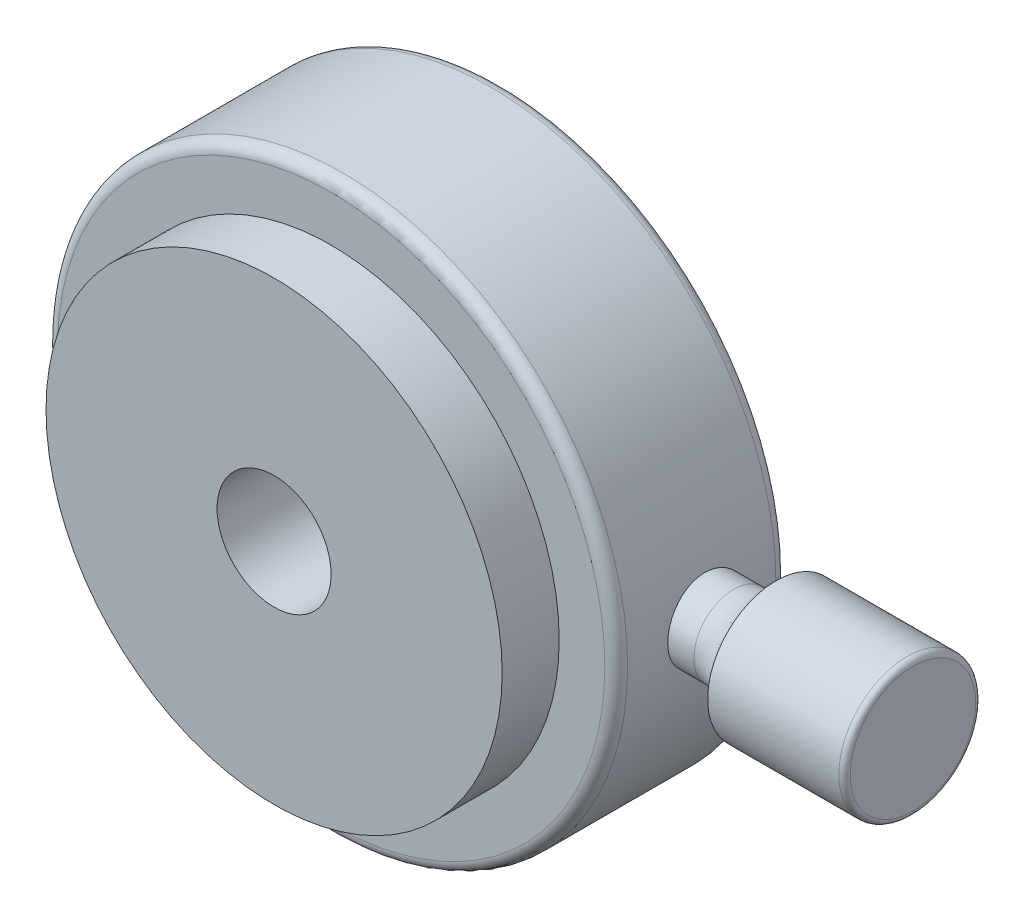
ISO-10303-21;
HEADER;
FILE_DESCRIPTION(('STEP AP214'),'2;1');
FILE_NAME('part.step','',(''),(''),'','','');
FILE_SCHEMA(('AUTOMOTIVE_DESIGN { 1 0 10303 214 1 1 1 1 }'));
ENDSEC;
DATA;
#1=APPLICATION_CONTEXT('core data for automotive mechanical design processes');
#2=APPLICATION_PROTOCOL_DEFINITION('international standard','automotive_design',2000,#1);
#3=PRODUCT_CONTEXT('',#1,'mechanical');
#4=PRODUCT('Part','Part','',(#3));
#5=PRODUCT_RELATED_PRODUCT_CATEGORY('part','',(#4));
#6=PRODUCT_DEFINITION_FORMATION('','',#4);
#7=PRODUCT_DEFINITION_CONTEXT('part definition',#1,'design');
#8=PRODUCT_DEFINITION('design','',#6,#7);
#9=PRODUCT_DEFINITION_SHAPE('','',#8);
#10=(LENGTH_UNIT() NAMED_UNIT(*) SI_UNIT(.MILLI.,.METRE.));
#11=(NAMED_UNIT(*) PLANE_ANGLE_UNIT() SI_UNIT($,.RADIAN.));
#12=(NAMED_UNIT(*) SI_UNIT($,.STERADIAN.) SOLID_ANGLE_UNIT());
#13=UNCERTAINTY_MEASURE_WITH_UNIT(LENGTH_MEASURE(1.E-05),#10,'distance_accuracy_value','');
#14=(GEOMETRIC_REPRESENTATION_CONTEXT(3) GLOBAL_UNCERTAINTY_ASSIGNED_CONTEXT((#13)) GLOBAL_UNIT_ASSIGNED_CONTEXT((#10,
#11,#12)) REPRESENTATION_CONTEXT('',''));
#15=CARTESIAN_POINT('',(0.,0.,0.));
#16=DIRECTION('',(0.,0.,1.));
#17=DIRECTION('',(1.,0.,0.));
#18=AXIS2_PLACEMENT_3D('',#15,#16,#17);
#19=CARTESIAN_POINT('',(0.,0.,20.));
#20=DIRECTION('',(0.,0.,-1.));
#21=DIRECTION('',(-1.,0.,0.));
#22=AXIS2_PLACEMENT_3D('',#19,#20,#21);
#23=CYLINDRICAL_SURFACE('',#22,25.);
#24=CARTESIAN_POINT('',(0.,0.,14.));
#25=DIRECTION('',(0.,0.,1.));
#26=DIRECTION('',(1.,0.,0.));
#27=AXIS2_PLACEMENT_3D('',#24,#25,#26);
#28=CIRCLE('',#27,25.);
#29=CARTESIAN_POINT('',(25.,0.,14.));
#30=VERTEX_POINT('',#29);
#31=EDGE_CURVE('E10',#30,#30,#28,.F.);
#32=ORIENTED_EDGE('',*,*,#31,.T.);
#33=EDGE_LOOP('',(#32));
#34=FACE_BOUND('',#33,.T.);
#35=CARTESIAN_POINT('',(0.,0.,1.));
#36=DIRECTION('',(0.,0.,1.));
#37=DIRECTION('',(1.,0.,0.));
#38=AXIS2_PLACEMENT_3D('',#35,#36,#37);
#39=CIRCLE('',#38,25.);
#40=CARTESIAN_POINT('',(25.,0.,1.));
#41=VERTEX_POINT('',#40);
#42=EDGE_CURVE('E46',#41,#41,#39,.T.);
#43=ORIENTED_EDGE('',*,*,#42,.T.);
#44=EDGE_LOOP('',(#43));
#45=FACE_BOUND('',#44,.T.);
#46=CARTESIAN_POINT('',(25.,0.,10.4832262334966));
#47=CARTESIAN_POINT('',(24.9999970176063,-0.195570742970434,10.4832180592283));
#48=CARTESIAN_POINT('',(24.9976809957743,-0.391258654311664,10.4667789583617));
#49=CARTESIAN_POINT('',(24.9886647697315,-0.777175004077514,10.4014676884545));
#50=CARTESIAN_POINT('',(24.9819601664713,-0.967397764382741,10.3525629756643));
#51=CARTESIAN_POINT('',(24.9649210103539,-1.33674214307026,10.2238016938027));
#52=CARTESIAN_POINT('',(24.954589075763,-1.51587165931347,10.1439674458788));
#53=CARTESIAN_POINT('',(24.9314400607072,-1.85816108849893,9.9556655186123));
#54=CARTESIAN_POINT('',(24.918623359462,-2.02132343260508,9.84720220766218));
#55=CARTESIAN_POINT('',(24.8918344121167,-2.32819354537413,9.60392923385688));
#56=CARTESIAN_POINT('',(24.8778555790759,-2.47177624724488,9.46896251780644));
#57=CARTESIAN_POINT('',(24.8503700719734,-2.73433301369379,9.17685169663006));
#58=CARTESIAN_POINT('',(24.8368634237504,-2.85330573331174,9.01970638021051));
#59=CARTESIAN_POINT('',(24.8117873738253,-3.06374374623177,8.68686989849577));
#60=CARTESIAN_POINT('',(24.8002264781108,-3.15508958481628,8.51110251091403));
#61=CARTESIAN_POINT('',(24.7804397305765,-3.30691771566836,8.1465321589285));
#62=CARTESIAN_POINT('',(24.7722137205098,-3.36740147243805,7.95772981355695));
#63=CARTESIAN_POINT('',(24.7600922282601,-3.45540346500133,7.57375762375901));
#64=CARTESIAN_POINT('',(24.7561687799919,-3.48313467991529,7.37863749035471));
#65=CARTESIAN_POINT('',(24.7530114923225,-3.50550387523255,6.98647667014665));
#66=CARTESIAN_POINT('',(24.7537774178066,-3.50014351477353,6.78943608012484));
#67=CARTESIAN_POINT('',(24.7598867512402,-3.45665609443046,6.4005235409128));
#68=CARTESIAN_POINT('',(24.7651971750381,-3.41876513654997,6.20862459891659));
#69=CARTESIAN_POINT('',(24.7797456703488,-3.31166118779443,5.83393559127942));
#70=CARTESIAN_POINT('',(24.7889838397833,-3.24244741601386,5.65114575286262));
#71=CARTESIAN_POINT('',(24.8103837697583,-3.07441355823629,5.29913896456924));
#72=CARTESIAN_POINT('',(24.8225554849105,-2.97549237651918,5.12997090364507));
#73=CARTESIAN_POINT('',(24.848443673221,-2.75092383753964,4.81054597719025));
#74=CARTESIAN_POINT('',(24.8621602348336,-2.62527494954486,4.66029019557658));
#75=CARTESIAN_POINT('',(24.8897387365563,-2.34951644252588,4.38158579830341));
#76=CARTESIAN_POINT('',(24.9036009036065,-2.1992036099948,4.25333818521881));
#77=CARTESIAN_POINT('',(24.9297975950593,-1.87907961805429,4.02386073567364));
#78=CARTESIAN_POINT('',(24.9421321142372,-1.70926839196206,3.92263099161575));
#79=CARTESIAN_POINT('',(24.9638943133628,-1.35480180611974,3.75005679697451));
#80=CARTESIAN_POINT('',(24.9733206042101,-1.17013940570454,3.67872662195274));
#81=CARTESIAN_POINT('',(24.9881922918814,-0.791296074470108,3.56814469308335));
#82=CARTESIAN_POINT('',(24.9936379228574,-0.5971157042376,3.52889105240161));
#83=CARTESIAN_POINT('',(24.9999039529595,-0.206484619473599,3.48384088453226));
#84=CARTESIAN_POINT('',(25.0007625844934,-0.0100663906078466,3.47776778948761));
#85=CARTESIAN_POINT('',(24.9978615877468,0.380985361793391,3.49851879128312));
#86=CARTESIAN_POINT('',(24.9941020835279,0.575618933130424,3.52534200439651));
#87=CARTESIAN_POINT('',(24.9824109253701,0.956747830526828,3.61089430664105));
#88=CARTESIAN_POINT('',(24.9744967374262,1.14327371287825,3.66948986076997));
#89=CARTESIAN_POINT('',(24.9553812974364,1.50385292441477,3.81678355264141));
#90=CARTESIAN_POINT('',(24.9441799085868,1.6779057341326,3.90548294323994));
#91=CARTESIAN_POINT('',(24.9196412824301,2.00982227029193,4.11112383527056));
#92=CARTESIAN_POINT('',(24.9062908503287,2.16757540367405,4.22824223776781));
#93=CARTESIAN_POINT('',(24.8789845615088,2.46128538373665,4.48714864025714));
#94=CARTESIAN_POINT('',(24.8650286743798,2.59724113397425,4.62893788048384));
#95=CARTESIAN_POINT('',(24.837964517793,2.84449288719778,4.93438697314363));
#96=CARTESIAN_POINT('',(24.8248630725174,2.95560434633902,5.09819690319202));
#97=CARTESIAN_POINT('',(24.8011084829779,3.14873404639813,5.44231732922904));
#98=CARTESIAN_POINT('',(24.7904552794842,3.23075299116995,5.6226274258857));
#99=CARTESIAN_POINT('',(24.7728516368328,3.36307801706001,5.99406057592532));
#100=CARTESIAN_POINT('',(24.7658895295772,3.41348412457339,6.18514741732661));
#101=CARTESIAN_POINT('',(24.756424338007,3.48147267623345,6.57317810451184));
#102=CARTESIAN_POINT('',(24.7539209886034,3.49905707175051,6.77012160138896));
#103=CARTESIAN_POINT('',(24.7536657626721,3.5008610800916,7.16243727026385));
#104=CARTESIAN_POINT('',(24.7558725811514,3.48537073560524,7.35780814417351));
#105=CARTESIAN_POINT('',(24.7646996795934,3.42208342908976,7.74313846676543));
#106=CARTESIAN_POINT('',(24.7713199559317,3.37428649359221,7.93309791989164));
#107=CARTESIAN_POINT('',(24.7882142913337,3.24784044801316,8.30215043433931));
#108=CARTESIAN_POINT('',(24.7984862604381,3.16920898269277,8.48124964277249));
#109=CARTESIAN_POINT('',(24.8215294834637,2.98335451775796,8.8237597539607));
#110=CARTESIAN_POINT('',(24.8343007998048,2.87613080404222,8.98717026474641));
#111=CARTESIAN_POINT('',(24.8610374521525,2.6350720011466,9.29514205990198));
#112=CARTESIAN_POINT('',(24.875011897247,2.50102143681407,9.43953391100334));
#113=CARTESIAN_POINT('',(24.9025023174653,2.2105683780489,9.70387919101292));
#114=CARTESIAN_POINT('',(24.9160181846886,2.05416066763029,9.82382690114835));
#115=CARTESIAN_POINT('',(24.941141364036,1.7225630637984,10.0363814858853));
#116=CARTESIAN_POINT('',(24.9527392669044,1.54728715573015,10.1288552445862));
#117=CARTESIAN_POINT('',(24.9726265472969,1.18361903347201,10.2829173475781));
#118=CARTESIAN_POINT('',(24.9809194209081,0.995240928056702,10.344538345959));
#119=CARTESIAN_POINT('',(24.9913242600027,0.671634302408155,10.4208392900746));
#120=CARTESIAN_POINT('',(24.9945613190328,0.538422583784907,10.4441995502156));
#121=CARTESIAN_POINT('',(24.9989002083803,0.270159204102643,10.4753957667632));
#122=CARTESIAN_POINT('',(25.0000020603488,0.135107561714605,10.4832318805859));
#123=CARTESIAN_POINT('',(25.,0.,10.4832262334966));
#124=B_SPLINE_CURVE_WITH_KNOTS('',3,(#46,#47,#48,#49,#50,#51,#52,#53,#54,#55,#56,#57,#58,#59,
#60,#61,#62,#63,#64,#65,#66,#67,#68,#69,#70,#71,#72,#73,#74,#75,#76,#77,#78,#79,#80,#81,#82,#83,
#84,#85,#86,#87,#88,#89,#90,#91,#92,#93,#94,#95,#96,#97,#98,#99,#100,#101,#102,#103,#104,#105,
#106,#107,#108,#109,#110,#111,#112,#113,#114,#115,#116,#117,#118,#119,#120,#121,#122,#123),
.UNSPECIFIED.,.T.,.F.,(4,2,2,2,2,2,2,2,2,2,2,2,2,2,2,2,2,2,2,2,2,2,2,2,2,2,2,2,2,2,2,2,2,2,2,2,
2,2,4),(0.,0.586218614249914,1.17302574711756,1.75941018101674,2.34570519256895,
2.93558542263616,3.52549788173698,4.11792572603133,4.71032545516015,5.29885141296036,
5.88734786362289,6.47160886199991,7.05588442732396,7.64217128551205,8.22849173019637,
8.81991093883668,9.41133217013912,10.0030354550019,10.5947039316677,11.1814330981178,
11.7681465030146,12.3524129282013,12.9367036722645,13.5247292360132,14.1127843691054,
14.705072299911,15.2973459001353,15.8877359013683,16.4780908006462,17.0632899676966,
17.6484886541567,18.2333529538661,18.8182318621328,19.4080120921192,19.9979301447795,
20.5906615050764,21.1827641943972,21.5877499787411,21.9927316564709),.UNSPECIFIED.);
#125=CARTESIAN_POINT('',(25.,0.,10.4832262334966));
#126=VERTEX_POINT('',#125);
#127=EDGE_CURVE('E60',#126,#126,#124,.T.);
#128=ORIENTED_EDGE('',*,*,#127,.F.);
#129=EDGE_LOOP('',(#128));
#130=FACE_BOUND('',#129,.T.);
#131=ADVANCED_FACE('F31',(#34,#45,#130),#23,.T.);
#132=CARTESIAN_POINT('',(0.,0.,10.));
#133=DIRECTION('',(0.,0.,1.));
#134=DIRECTION('',(1.,0.,0.));
#135=AXIS2_PLACEMENT_3D('',#132,#133,#134);
#136=CYLINDRICAL_SURFACE('',#135,5.);
#137=CARTESIAN_POINT('',(0.,0.,10.));
#138=DIRECTION('',(0.,0.,1.));
#139=DIRECTION('',(1.,0.,0.));
#140=AXIS2_PLACEMENT_3D('',#137,#138,#139);
#141=CIRCLE('',#140,5.);
#142=CARTESIAN_POINT('',(5.,0.,10.));
#143=VERTEX_POINT('',#142);
#144=EDGE_CURVE('E69',#143,#143,#141,.T.);
#145=ORIENTED_EDGE('',*,*,#144,.F.);
#146=EDGE_LOOP('',(#145));
#147=FACE_BOUND('',#146,.T.);
#148=CARTESIAN_POINT('',(0.,0.,20.));
#149=DIRECTION('',(0.,0.,1.));
#150=DIRECTION('',(1.,0.,0.));
#151=AXIS2_PLACEMENT_3D('',#148,#149,#150);
#152=CIRCLE('',#151,5.);
#153=CARTESIAN_POINT('',(5.,0.,20.));
#154=VERTEX_POINT('',#153);
#155=EDGE_CURVE('E148',#154,#154,#152,.T.);
#156=ORIENTED_EDGE('',*,*,#155,.T.);
#157=EDGE_LOOP('',(#156));
#158=FACE_BOUND('',#157,.T.);
#159=ADVANCED_FACE('F105',(#147,#158),#136,.F.);
#160=CARTESIAN_POINT('',(0.,0.,5.));
#161=DIRECTION('',(0.,0.,1.));
#162=DIRECTION('',(1.,0.,0.));
#163=AXIS2_PLACEMENT_3D('',#160,#161,#162);
#164=CYLINDRICAL_SURFACE('',#163,10.);
#165=CARTESIAN_POINT('',(0.,0.,5.));
#166=DIRECTION('',(0.,0.,1.));
#167=DIRECTION('',(1.,0.,0.));
#168=AXIS2_PLACEMENT_3D('',#165,#166,#167);
#169=CIRCLE('',#168,10.);
#170=CARTESIAN_POINT('',(10.,0.,5.));
#171=VERTEX_POINT('',#170);
#172=EDGE_CURVE('E159',#171,#171,#169,.T.);
#173=ORIENTED_EDGE('',*,*,#172,.F.);
#174=EDGE_LOOP('',(#173));
#175=FACE_BOUND('',#174,.T.);
#176=CARTESIAN_POINT('',(0.,0.,10.));
#177=DIRECTION('',(0.,0.,1.));
#178=DIRECTION('',(1.,0.,0.));
#179=AXIS2_PLACEMENT_3D('',#176,#177,#178);
#180=CIRCLE('',#179,10.);
#181=CARTESIAN_POINT('',(10.,0.,10.));
#182=VERTEX_POINT('',#181);
#183=EDGE_CURVE('E156',#182,#182,#180,.T.);
#184=ORIENTED_EDGE('',*,*,#183,.T.);
#185=EDGE_LOOP('',(#184));
#186=FACE_BOUND('',#185,.T.);
#187=ADVANCED_FACE('F98',(#175,#186),#164,.F.);
#188=CARTESIAN_POINT('',(0.,0.,5.));
#189=DIRECTION('',(0.,0.,1.));
#190=DIRECTION('',(1.,0.,0.));
#191=AXIS2_PLACEMENT_3D('',#188,#189,#190);
#192=PLANE('',#191);
#193=ORIENTED_EDGE('',*,*,#172,.T.);
#194=EDGE_LOOP('',(#193));
#195=FACE_BOUND('',#194,.T.);
#196=ADVANCED_FACE('F95',(#195),#192,.T.);
#197=CARTESIAN_POINT('',(0.,0.,10.));
#198=DIRECTION('',(0.,0.,1.));
#199=DIRECTION('',(1.,0.,0.));
#200=AXIS2_PLACEMENT_3D('',#197,#198,#199);
#201=PLANE('',#200);
#202=ORIENTED_EDGE('',*,*,#144,.T.);
#203=EDGE_LOOP('',(#202));
#204=FACE_BOUND('',#203,.T.);
#205=ORIENTED_EDGE('',*,*,#183,.F.);
#206=EDGE_LOOP('',(#205));
#207=FACE_BOUND('',#206,.T.);
#208=ADVANCED_FACE('F87',(#204,#207),#201,.F.);
#209=CARTESIAN_POINT('',(0.,0.,20.));
#210=DIRECTION('',(0.,0.,1.));
#211=DIRECTION('',(1.,0.,0.));
#212=AXIS2_PLACEMENT_3D('',#209,#210,#211);
#213=PLANE('',#212);
#214=CARTESIAN_POINT('',(0.,0.,20.));
#215=DIRECTION('',(0.,0.,1.));
#216=DIRECTION('',(1.,0.,0.));
#217=AXIS2_PLACEMENT_3D('',#214,#215,#216);
#218=CIRCLE('',#217,20.);
#219=CARTESIAN_POINT('',(20.,0.,20.));
#220=VERTEX_POINT('',#219);
#221=EDGE_CURVE('E151',#220,#220,#218,.T.);
#222=ORIENTED_EDGE('',*,*,#221,.T.);
#223=EDGE_LOOP('',(#222));
#224=FACE_BOUND('',#223,.T.);
#225=ORIENTED_EDGE('',*,*,#155,.F.);
#226=EDGE_LOOP('',(#225));
#227=FACE_BOUND('',#226,.T.);
#228=ADVANCED_FACE('F83',(#224,#227),#213,.T.);
#229=CARTESIAN_POINT('',(0.,0.,20.));
#230=DIRECTION('',(0.,0.,-1.));
#231=DIRECTION('',(-1.,0.,0.));
#232=AXIS2_PLACEMENT_3D('',#229,#230,#231);
#233=CYLINDRICAL_SURFACE('',#232,20.);
#234=ORIENTED_EDGE('',*,*,#221,.F.);
#235=EDGE_LOOP('',(#234));
#236=FACE_BOUND('',#235,.T.);
#237=CARTESIAN_POINT('',(0.,0.,15.));
#238=DIRECTION('',(0.,0.,1.));
#239=DIRECTION('',(1.,0.,0.));
#240=AXIS2_PLACEMENT_3D('',#237,#238,#239);
#241=CIRCLE('',#240,20.);
#242=CARTESIAN_POINT('',(20.,0.,15.));
#243=VERTEX_POINT('',#242);
#244=EDGE_CURVE('E68',#243,#243,#241,.T.);
#245=ORIENTED_EDGE('',*,*,#244,.T.);
#246=EDGE_LOOP('',(#245));
#247=FACE_BOUND('',#246,.T.);
#248=ADVANCED_FACE('F86',(#236,#247),#233,.T.);
#249=CARTESIAN_POINT('',(0.,0.,0.));
#250=DIRECTION('',(0.,0.,1.));
#251=DIRECTION('',(1.,0.,0.));
#252=AXIS2_PLACEMENT_3D('',#249,#250,#251);
#253=PLANE('',#252);
#254=CARTESIAN_POINT('',(0.,0.,0.));
#255=DIRECTION('',(0.,0.,1.));
#256=DIRECTION('',(1.,0.,0.));
#257=AXIS2_PLACEMENT_3D('',#254,#255,#256);
#258=CIRCLE('',#257,24.);
#259=CARTESIAN_POINT('',(24.,0.,0.));
#260=VERTEX_POINT('',#259);
#261=EDGE_CURVE('E42',#260,#260,#258,.F.);
#262=ORIENTED_EDGE('',*,*,#261,.T.);
#263=EDGE_LOOP('',(#262));
#264=FACE_BOUND('',#263,.T.);
#265=ADVANCED_FACE('F91',(#264),#253,.F.);
#266=CARTESIAN_POINT('',(0.,0.,15.));
#267=DIRECTION('',(0.,0.,1.));
#268=DIRECTION('',(1.,0.,0.));
#269=AXIS2_PLACEMENT_3D('',#266,#267,#268);
#270=PLANE('',#269);
#271=CARTESIAN_POINT('',(0.,0.,15.));
#272=DIRECTION('',(0.,0.,1.));
#273=DIRECTION('',(1.,0.,0.));
#274=AXIS2_PLACEMENT_3D('',#271,#272,#273);
#275=CIRCLE('',#274,24.);
#276=CARTESIAN_POINT('',(24.,0.,15.));
#277=VERTEX_POINT('',#276);
#278=EDGE_CURVE('E38',#277,#277,#275,.T.);
#279=ORIENTED_EDGE('',*,*,#278,.T.);
#280=EDGE_LOOP('',(#279));
#281=FACE_BOUND('',#280,.T.);
#282=ORIENTED_EDGE('',*,*,#244,.F.);
#283=EDGE_LOOP('',(#282));
#284=FACE_BOUND('',#283,.T.);
#285=ADVANCED_FACE('F80',(#281,#284),#270,.T.);
#286=CARTESIAN_POINT('',(31.,0.,6.98322623349656));
#287=DIRECTION('',(-1.,0.,0.));
#288=DIRECTION('',(0.,0.,1.));
#289=AXIS2_PLACEMENT_3D('',#286,#287,#288);
#290=CYLINDRICAL_SURFACE('',#289,3.5);
#291=CARTESIAN_POINT('',(27.2919007564522,0.,6.98322623349656));
#292=DIRECTION('',(1.,0.,0.));
#293=DIRECTION('',(0.,0.,-1.));
#294=AXIS2_PLACEMENT_3D('',#291,#292,#293);
#295=CIRCLE('',#294,3.5);
#296=CARTESIAN_POINT('',(27.2919007564522,0.,3.48322623349656));
#297=VERTEX_POINT('',#296);
#298=EDGE_CURVE('E57',#297,#297,#295,.F.);
#299=ORIENTED_EDGE('',*,*,#298,.T.);
#300=EDGE_LOOP('',(#299));
#301=FACE_BOUND('',#300,.T.);
#302=ORIENTED_EDGE('',*,*,#127,.T.);
#303=EDGE_LOOP('',(#302));
#304=FACE_BOUND('',#303,.T.);
#305=ADVANCED_FACE('F74',(#301,#304),#290,.T.);
#306=CARTESIAN_POINT('',(43.,0.,6.98322623349656));
#307=DIRECTION('',(-1.,0.,0.));
#308=DIRECTION('',(0.,0.,1.));
#309=AXIS2_PLACEMENT_3D('',#306,#307,#308);
#310=CYLINDRICAL_SURFACE('',#309,6.);
#311=CARTESIAN_POINT('',(42.5,0.,6.98322623349656));
#312=DIRECTION('',(1.,0.,0.));
#313=DIRECTION('',(0.,0.,-1.));
#314=AXIS2_PLACEMENT_3D('',#311,#312,#313);
#315=CIRCLE('',#314,6.);
#316=CARTESIAN_POINT('',(42.5,0.,0.983226233496557));
#317=VERTEX_POINT('',#316);
#318=EDGE_CURVE('E51',#317,#317,#315,.F.);
#319=ORIENTED_EDGE('',*,*,#318,.T.);
#320=EDGE_LOOP('',(#319));
#321=FACE_BOUND('',#320,.T.);
#322=CARTESIAN_POINT('',(31.,0.,6.98322623349656));
#323=DIRECTION('',(1.,0.,0.));
#324=DIRECTION('',(0.,0.,-1.));
#325=AXIS2_PLACEMENT_3D('',#322,#323,#324);
#326=CIRCLE('',#325,6.);
#327=CARTESIAN_POINT('',(31.,0.,0.983226233496557));
#328=VERTEX_POINT('',#327);
#329=EDGE_CURVE('E146',#328,#328,#326,.T.);
#330=ORIENTED_EDGE('',*,*,#329,.T.);
#331=EDGE_LOOP('',(#330));
#332=FACE_BOUND('',#331,.T.);
#333=ADVANCED_FACE('F79',(#321,#332),#310,.T.);
#334=CARTESIAN_POINT('',(43.,0.,6.98322623349656));
#335=DIRECTION('',(1.,0.,0.));
#336=DIRECTION('',(0.,0.,-1.));
#337=AXIS2_PLACEMENT_3D('',#334,#335,#336);
#338=PLANE('',#337);
#339=CARTESIAN_POINT('',(43.,0.,6.98322623349656));
#340=DIRECTION('',(1.,0.,0.));
#341=DIRECTION('',(0.,0.,-1.));
#342=AXIS2_PLACEMENT_3D('',#339,#340,#341);
#343=CIRCLE('',#342,5.5);
#344=CARTESIAN_POINT('',(43.,0.,1.48322623349656));
#345=VERTEX_POINT('',#344);
#346=EDGE_CURVE('E54',#345,#345,#343,.T.);
#347=ORIENTED_EDGE('',*,*,#346,.T.);
#348=EDGE_LOOP('',(#347));
#349=FACE_BOUND('',#348,.T.);
#350=ADVANCED_FACE('F136',(#349),#338,.T.);
#351=CARTESIAN_POINT('',(27.2919007564522,0.,6.98322623349656));
#352=DIRECTION('',(1.,0.,0.));
#353=DIRECTION('',(0.,0.,-1.));
#354=AXIS2_PLACEMENT_3D('',#351,#352,#353);
#355=TOROIDAL_SURFACE('',#354,7.5,4.);
#356=ORIENTED_EDGE('',*,*,#298,.F.);
#357=EDGE_LOOP('',(#356));
#358=FACE_BOUND('',#357,.T.);
#359=ORIENTED_EDGE('',*,*,#329,.F.);
#360=EDGE_LOOP('',(#359));
#361=FACE_BOUND('',#360,.T.);
#362=ADVANCED_FACE('F131',(#358,#361),#355,.F.);
#363=CARTESIAN_POINT('',(42.5,0.,6.98322623349656));
#364=DIRECTION('',(1.,0.,0.));
#365=DIRECTION('',(0.,0.,-1.));
#366=AXIS2_PLACEMENT_3D('',#363,#364,#365);
#367=TOROIDAL_SURFACE('',#366,5.5,0.5);
#368=ORIENTED_EDGE('',*,*,#318,.F.);
#369=EDGE_LOOP('',(#368));
#370=FACE_BOUND('',#369,.T.);
#371=ORIENTED_EDGE('',*,*,#346,.F.);
#372=EDGE_LOOP('',(#371));
#373=FACE_BOUND('',#372,.T.);
#374=ADVANCED_FACE('F124',(#370,#373),#367,.T.);
#375=CARTESIAN_POINT('',(0.,0.,1.));
#376=DIRECTION('',(0.,0.,1.));
#377=DIRECTION('',(1.,0.,0.));
#378=AXIS2_PLACEMENT_3D('',#375,#376,#377);
#379=TOROIDAL_SURFACE('',#378,24.,1.);
#380=ORIENTED_EDGE('',*,*,#261,.F.);
#381=EDGE_LOOP('',(#380));
#382=FACE_BOUND('',#381,.T.);
#383=ORIENTED_EDGE('',*,*,#42,.F.);
#384=EDGE_LOOP('',(#383));
#385=FACE_BOUND('',#384,.T.);
#386=ADVANCED_FACE('F122',(#382,#385),#379,.T.);
#387=CARTESIAN_POINT('',(0.,0.,14.));
#388=DIRECTION('',(0.,0.,1.));
#389=DIRECTION('',(1.,0.,0.));
#390=AXIS2_PLACEMENT_3D('',#387,#388,#389);
#391=TOROIDAL_SURFACE('',#390,24.,1.);
#392=ORIENTED_EDGE('',*,*,#31,.F.);
#393=EDGE_LOOP('',(#392));
#394=FACE_BOUND('',#393,.T.);
#395=ORIENTED_EDGE('',*,*,#278,.F.);
#396=EDGE_LOOP('',(#395));
#397=FACE_BOUND('',#396,.T.);
#398=ADVANCED_FACE('F33',(#394,#397),#391,.T.);
#399=CLOSED_SHELL('',(#131,#159,#187,#196,#208,#228,#248,#265,#285,#305,#333,#350,#362,#374,
#386,#398));
#400=MANIFOLD_SOLID_BREP('B2',#399);
#401=ADVANCED_BREP_SHAPE_REPRESENTATION('',(#18,#400),#14);
#402=SHAPE_DEFINITION_REPRESENTATION(#9,#401);
ENDSEC;
END-ISO-10303-21;
